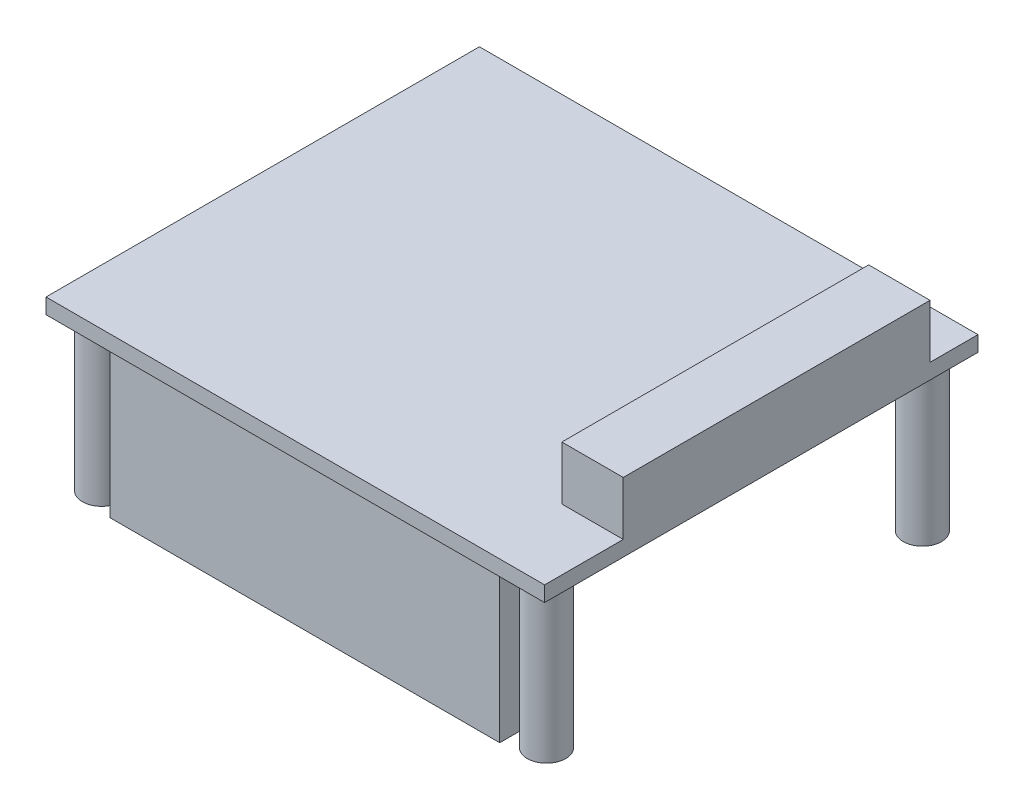
ISO-10303-21;
HEADER;
FILE_DESCRIPTION(('STEP AP214'),'2;1');
FILE_NAME('part.step','',(''),(''),'','','');
FILE_SCHEMA(('AUTOMOTIVE_DESIGN { 1 0 10303 214 1 1 1 1 }'));
ENDSEC;
DATA;
#1=APPLICATION_CONTEXT('core data for automotive mechanical design processes');
#2=APPLICATION_PROTOCOL_DEFINITION('international standard','automotive_design',2000,#1);
#3=PRODUCT_CONTEXT('',#1,'mechanical');
#4=PRODUCT('Part','Part','',(#3));
#5=PRODUCT_RELATED_PRODUCT_CATEGORY('part','',(#4));
#6=PRODUCT_DEFINITION_FORMATION('','',#4);
#7=PRODUCT_DEFINITION_CONTEXT('part definition',#1,'design');
#8=PRODUCT_DEFINITION('design','',#6,#7);
#9=PRODUCT_DEFINITION_SHAPE('','',#8);
#10=(LENGTH_UNIT() NAMED_UNIT(*) SI_UNIT(.MILLI.,.METRE.));
#11=(NAMED_UNIT(*) PLANE_ANGLE_UNIT() SI_UNIT($,.RADIAN.));
#12=(NAMED_UNIT(*) SI_UNIT($,.STERADIAN.) SOLID_ANGLE_UNIT());
#13=UNCERTAINTY_MEASURE_WITH_UNIT(LENGTH_MEASURE(1.E-05),#10,'distance_accuracy_value','');
#14=(GEOMETRIC_REPRESENTATION_CONTEXT(3) GLOBAL_UNCERTAINTY_ASSIGNED_CONTEXT((#13)) GLOBAL_UNIT_ASSIGNED_CONTEXT((#10,
#11,#12)) REPRESENTATION_CONTEXT('',''));
#15=CARTESIAN_POINT('',(0.,0.,0.));
#16=DIRECTION('',(0.,0.,1.));
#17=DIRECTION('',(1.,0.,0.));
#18=AXIS2_PLACEMENT_3D('',#15,#16,#17);
#19=CARTESIAN_POINT('',(0.,20.,0.));
#20=DIRECTION('',(0.,1.,0.));
#21=DIRECTION('',(0.,0.,1.));
#22=AXIS2_PLACEMENT_3D('',#19,#20,#21);
#23=PLANE('',#22);
#24=DIRECTION('',(0.,0.,1.));
#25=VECTOR('',#24,1.);
#26=CARTESIAN_POINT('',(-32.5,20.,-28.25));
#27=LINE('',#26,#25);
#28=CARTESIAN_POINT('',(-32.5,20.,-28.25));
#29=VERTEX_POINT('',#28);
#30=CARTESIAN_POINT('',(-32.5,20.,28.25));
#31=VERTEX_POINT('',#30);
#32=EDGE_CURVE('E193',#29,#31,#27,.T.);
#33=ORIENTED_EDGE('',*,*,#32,.F.);
#34=DIRECTION('',(-1.,0.,0.));
#35=VECTOR('',#34,1.);
#36=CARTESIAN_POINT('',(32.5,20.,-28.25));
#37=LINE('',#36,#35);
#38=CARTESIAN_POINT('',(32.5,20.,-28.25));
#39=VERTEX_POINT('',#38);
#40=EDGE_CURVE('E199',#39,#29,#37,.T.);
#41=ORIENTED_EDGE('',*,*,#40,.F.);
#42=DIRECTION('',(0.,0.,-1.));
#43=VECTOR('',#42,1.);
#44=CARTESIAN_POINT('',(32.5,20.,28.25));
#45=LINE('',#44,#43);
#46=CARTESIAN_POINT('',(32.5,20.,28.25));
#47=VERTEX_POINT('',#46);
#48=EDGE_CURVE('E215',#47,#39,#45,.T.);
#49=ORIENTED_EDGE('',*,*,#48,.F.);
#50=DIRECTION('',(1.,0.,0.));
#51=VECTOR('',#50,1.);
#52=CARTESIAN_POINT('',(-32.5,20.,28.25));
#53=LINE('',#52,#51);
#54=EDGE_CURVE('E209',#31,#47,#53,.T.);
#55=ORIENTED_EDGE('',*,*,#54,.F.);
#56=EDGE_LOOP('',(#33,#41,#49,#55));
#57=FACE_BOUND('',#56,.T.);
#58=CARTESIAN_POINT('',(-29.,20.,-24.5));
#59=DIRECTION('',(0.,1.,0.));
#60=DIRECTION('',(0.,0.,1.));
#61=AXIS2_PLACEMENT_3D('',#58,#59,#60);
#62=CIRCLE('',#61,2.5);
#63=CARTESIAN_POINT('',(-29.,20.,-22.));
#64=VERTEX_POINT('',#63);
#65=EDGE_CURVE('E230',#64,#64,#62,.T.);
#66=ORIENTED_EDGE('',*,*,#65,.T.);
#67=EDGE_LOOP('',(#66));
#68=FACE_BOUND('',#67,.T.);
#69=CARTESIAN_POINT('',(-29.,20.,24.5));
#70=DIRECTION('',(0.,1.,0.));
#71=DIRECTION('',(0.,0.,1.));
#72=AXIS2_PLACEMENT_3D('',#69,#70,#71);
#73=CIRCLE('',#72,2.5);
#74=CARTESIAN_POINT('',(-29.,20.,27.));
#75=VERTEX_POINT('',#74);
#76=EDGE_CURVE('E229',#75,#75,#73,.F.);
#77=ORIENTED_EDGE('',*,*,#76,.F.);
#78=EDGE_LOOP('',(#77));
#79=FACE_BOUND('',#78,.T.);
#80=CARTESIAN_POINT('',(29.,20.,-24.5));
#81=DIRECTION('',(0.,1.,0.));
#82=DIRECTION('',(0.,0.,1.));
#83=AXIS2_PLACEMENT_3D('',#80,#81,#82);
#84=CIRCLE('',#83,2.5);
#85=CARTESIAN_POINT('',(29.,20.,-22.));
#86=VERTEX_POINT('',#85);
#87=EDGE_CURVE('E51',#86,#86,#84,.F.);
#88=ORIENTED_EDGE('',*,*,#87,.F.);
#89=EDGE_LOOP('',(#88));
#90=FACE_BOUND('',#89,.T.);
#91=CARTESIAN_POINT('',(29.,20.,24.5));
#92=DIRECTION('',(0.,1.,0.));
#93=DIRECTION('',(0.,0.,1.));
#94=AXIS2_PLACEMENT_3D('',#91,#92,#93);
#95=CIRCLE('',#94,2.5);
#96=CARTESIAN_POINT('',(29.,20.,27.));
#97=VERTEX_POINT('',#96);
#98=EDGE_CURVE('E11',#97,#97,#95,.F.);
#99=ORIENTED_EDGE('',*,*,#98,.F.);
#100=EDGE_LOOP('',(#99));
#101=FACE_BOUND('',#100,.T.);
#102=DIRECTION('',(0.,0.,1.));
#103=VECTOR('',#102,1.);
#104=CARTESIAN_POINT('',(-25.4,20.,22.));
#105=LINE('',#104,#103);
#106=CARTESIAN_POINT('',(-25.4,20.,22.));
#107=VERTEX_POINT('',#106);
#108=CARTESIAN_POINT('',(-25.4,20.,27.));
#109=VERTEX_POINT('',#108);
#110=EDGE_CURVE('E161',#107,#109,#105,.T.);
#111=ORIENTED_EDGE('',*,*,#110,.T.);
#112=DIRECTION('',(1.,0.,0.));
#113=VECTOR('',#112,1.);
#114=CARTESIAN_POINT('',(-25.4,20.,27.));
#115=LINE('',#114,#113);
#116=CARTESIAN_POINT('',(25.4,20.,27.));
#117=VERTEX_POINT('',#116);
#118=EDGE_CURVE('E162',#109,#117,#115,.T.);
#119=ORIENTED_EDGE('',*,*,#118,.T.);
#120=DIRECTION('',(0.,0.,-1.));
#121=VECTOR('',#120,1.);
#122=CARTESIAN_POINT('',(25.4,20.,27.));
#123=LINE('',#122,#121);
#124=CARTESIAN_POINT('',(25.4,20.,22.));
#125=VERTEX_POINT('',#124);
#126=EDGE_CURVE('E167',#117,#125,#123,.T.);
#127=ORIENTED_EDGE('',*,*,#126,.T.);
#128=DIRECTION('',(-1.,0.,0.));
#129=VECTOR('',#128,1.);
#130=CARTESIAN_POINT('',(25.4,20.,22.));
#131=LINE('',#130,#129);
#132=EDGE_CURVE('E169',#125,#107,#131,.T.);
#133=ORIENTED_EDGE('',*,*,#132,.T.);
#134=EDGE_LOOP('',(#111,#119,#127,#133));
#135=FACE_BOUND('',#134,.T.);
#136=ADVANCED_FACE('F43',(#57,#68,#79,#90,#101,#135),#23,.F.);
#137=CARTESIAN_POINT('',(-29.,20.,-24.5));
#138=DIRECTION('',(0.,-1.,0.));
#139=DIRECTION('',(0.,0.,-1.));
#140=AXIS2_PLACEMENT_3D('',#137,#138,#139);
#141=CYLINDRICAL_SURFACE('',#140,2.5);
#142=ORIENTED_EDGE('',*,*,#65,.F.);
#143=EDGE_LOOP('',(#142));
#144=FACE_BOUND('',#143,.T.);
#145=CARTESIAN_POINT('',(-29.,0.,-24.5));
#146=DIRECTION('',(0.,1.,0.));
#147=DIRECTION('',(0.,0.,1.));
#148=AXIS2_PLACEMENT_3D('',#145,#146,#147);
#149=CIRCLE('',#148,2.5);
#150=CARTESIAN_POINT('',(-29.,0.,-22.));
#151=VERTEX_POINT('',#150);
#152=EDGE_CURVE('E226',#151,#151,#149,.T.);
#153=ORIENTED_EDGE('',*,*,#152,.T.);
#154=EDGE_LOOP('',(#153));
#155=FACE_BOUND('',#154,.T.);
#156=ADVANCED_FACE('F44',(#144,#155),#141,.T.);
#157=CARTESIAN_POINT('',(-29.,0.,-24.5));
#158=DIRECTION('',(0.,1.,0.));
#159=DIRECTION('',(0.,0.,1.));
#160=AXIS2_PLACEMENT_3D('',#157,#158,#159);
#161=PLANE('',#160);
#162=ORIENTED_EDGE('',*,*,#152,.F.);
#163=EDGE_LOOP('',(#162));
#164=FACE_BOUND('',#163,.T.);
#165=ADVANCED_FACE('F319',(#164),#161,.F.);
#166=CARTESIAN_POINT('',(-32.5,22.,-28.25));
#167=DIRECTION('',(1.,0.,0.));
#168=DIRECTION('',(0.,0.,-1.));
#169=AXIS2_PLACEMENT_3D('',#166,#167,#168);
#170=PLANE('',#169);
#171=ORIENTED_EDGE('',*,*,#32,.T.);
#172=DIRECTION('',(0.,-1.,0.));
#173=VECTOR('',#172,1.);
#174=CARTESIAN_POINT('',(-32.5,22.,28.25));
#175=LINE('',#174,#173);
#176=CARTESIAN_POINT('',(-32.5,22.,28.25));
#177=VERTEX_POINT('',#176);
#178=EDGE_CURVE('E224',#177,#31,#175,.T.);
#179=ORIENTED_EDGE('',*,*,#178,.F.);
#180=DIRECTION('',(0.,0.,1.));
#181=VECTOR('',#180,1.);
#182=CARTESIAN_POINT('',(-32.5,22.,-28.25));
#183=LINE('',#182,#181);
#184=CARTESIAN_POINT('',(-32.5,22.,-28.25));
#185=VERTEX_POINT('',#184);
#186=EDGE_CURVE('E198',#185,#177,#183,.T.);
#187=ORIENTED_EDGE('',*,*,#186,.F.);
#188=DIRECTION('',(0.,-1.,0.));
#189=VECTOR('',#188,1.);
#190=CARTESIAN_POINT('',(-32.5,22.,-28.25));
#191=LINE('',#190,#189);
#192=EDGE_CURVE('E210',#185,#29,#191,.T.);
#193=ORIENTED_EDGE('',*,*,#192,.T.);
#194=EDGE_LOOP('',(#171,#179,#187,#193));
#195=FACE_BOUND('',#194,.T.);
#196=ADVANCED_FACE('F320',(#195),#170,.F.);
#197=CARTESIAN_POINT('',(-32.5,22.,28.25));
#198=DIRECTION('',(0.,0.,-1.));
#199=DIRECTION('',(-1.,0.,0.));
#200=AXIS2_PLACEMENT_3D('',#197,#198,#199);
#201=PLANE('',#200);
#202=ORIENTED_EDGE('',*,*,#54,.T.);
#203=DIRECTION('',(0.,-1.,0.));
#204=VECTOR('',#203,1.);
#205=CARTESIAN_POINT('',(32.5,22.,28.25));
#206=LINE('',#205,#204);
#207=CARTESIAN_POINT('',(32.5,22.,28.25));
#208=VERTEX_POINT('',#207);
#209=EDGE_CURVE('E219',#208,#47,#206,.T.);
#210=ORIENTED_EDGE('',*,*,#209,.F.);
#211=DIRECTION('',(1.,0.,0.));
#212=VECTOR('',#211,1.);
#213=CARTESIAN_POINT('',(-32.5,22.,28.25));
#214=LINE('',#213,#212);
#215=EDGE_CURVE('E200',#177,#208,#214,.T.);
#216=ORIENTED_EDGE('',*,*,#215,.F.);
#217=ORIENTED_EDGE('',*,*,#178,.T.);
#218=EDGE_LOOP('',(#202,#210,#216,#217));
#219=FACE_BOUND('',#218,.T.);
#220=ADVANCED_FACE('F311',(#219),#201,.F.);
#221=CARTESIAN_POINT('',(32.5,22.,28.25));
#222=DIRECTION('',(-1.,0.,0.));
#223=DIRECTION('',(0.,0.,1.));
#224=AXIS2_PLACEMENT_3D('',#221,#222,#223);
#225=PLANE('',#224);
#226=ORIENTED_EDGE('',*,*,#48,.T.);
#227=DIRECTION('',(0.,-1.,0.));
#228=VECTOR('',#227,1.);
#229=CARTESIAN_POINT('',(32.5,22.,-28.25));
#230=LINE('',#229,#228);
#231=CARTESIAN_POINT('',(32.5,22.,-28.25));
#232=VERTEX_POINT('',#231);
#233=EDGE_CURVE('E220',#232,#39,#230,.T.);
#234=ORIENTED_EDGE('',*,*,#233,.F.);
#235=DIRECTION('',(0.,0.,-1.));
#236=VECTOR('',#235,1.);
#237=CARTESIAN_POINT('',(32.5,22.,28.25));
#238=LINE('',#237,#236);
#239=CARTESIAN_POINT('',(32.5,22.,-22.));
#240=VERTEX_POINT('',#239);
#241=EDGE_CURVE('E205',#240,#232,#238,.T.);
#242=ORIENTED_EDGE('',*,*,#241,.F.);
#243=DIRECTION('',(0.,-1.,0.));
#244=VECTOR('',#243,1.);
#245=CARTESIAN_POINT('',(32.5,29.,-22.));
#246=LINE('',#245,#244);
#247=CARTESIAN_POINT('',(32.5,29.,-22.));
#248=VERTEX_POINT('',#247);
#249=EDGE_CURVE('E160',#248,#240,#246,.T.);
#250=ORIENTED_EDGE('',*,*,#249,.F.);
#251=DIRECTION('',(0.,0.,-1.));
#252=VECTOR('',#251,1.);
#253=CARTESIAN_POINT('',(32.5,29.,18.));
#254=LINE('',#253,#252);
#255=CARTESIAN_POINT('',(32.5,29.,18.));
#256=VERTEX_POINT('',#255);
#257=EDGE_CURVE('E136',#256,#248,#254,.T.);
#258=ORIENTED_EDGE('',*,*,#257,.F.);
#259=DIRECTION('',(0.,-1.,0.));
#260=VECTOR('',#259,1.);
#261=CARTESIAN_POINT('',(32.5,29.,18.));
#262=LINE('',#261,#260);
#263=CARTESIAN_POINT('',(32.5,22.,18.));
#264=VERTEX_POINT('',#263);
#265=EDGE_CURVE('E137',#256,#264,#262,.T.);
#266=ORIENTED_EDGE('',*,*,#265,.T.);
#267=EDGE_CURVE('E201',#208,#264,#238,.T.);
#268=ORIENTED_EDGE('',*,*,#267,.F.);
#269=ORIENTED_EDGE('',*,*,#209,.T.);
#270=EDGE_LOOP('',(#226,#234,#242,#250,#258,#266,#268,#269));
#271=FACE_BOUND('',#270,.T.);
#272=ADVANCED_FACE('F310',(#271),#225,.F.);
#273=CARTESIAN_POINT('',(32.5,22.,-28.25));
#274=DIRECTION('',(0.,0.,1.));
#275=DIRECTION('',(1.,0.,0.));
#276=AXIS2_PLACEMENT_3D('',#273,#274,#275);
#277=PLANE('',#276);
#278=ORIENTED_EDGE('',*,*,#40,.T.);
#279=ORIENTED_EDGE('',*,*,#192,.F.);
#280=DIRECTION('',(-1.,0.,0.));
#281=VECTOR('',#280,1.);
#282=CARTESIAN_POINT('',(32.5,22.,-28.25));
#283=LINE('',#282,#281);
#284=EDGE_CURVE('E202',#232,#185,#283,.T.);
#285=ORIENTED_EDGE('',*,*,#284,.F.);
#286=ORIENTED_EDGE('',*,*,#233,.T.);
#287=EDGE_LOOP('',(#278,#279,#285,#286));
#288=FACE_BOUND('',#287,.T.);
#289=ADVANCED_FACE('F303',(#288),#277,.F.);
#290=CARTESIAN_POINT('',(0.,22.,0.));
#291=DIRECTION('',(0.,1.,0.));
#292=DIRECTION('',(0.,0.,1.));
#293=AXIS2_PLACEMENT_3D('',#290,#291,#292);
#294=PLANE('',#293);
#295=DIRECTION('',(-1.,0.,0.));
#296=VECTOR('',#295,1.);
#297=CARTESIAN_POINT('',(32.5,22.,-22.));
#298=LINE('',#297,#296);
#299=CARTESIAN_POINT('',(24.5,22.,-22.));
#300=VERTEX_POINT('',#299);
#301=EDGE_CURVE('E149',#240,#300,#298,.T.);
#302=ORIENTED_EDGE('',*,*,#301,.F.);
#303=ORIENTED_EDGE('',*,*,#241,.T.);
#304=ORIENTED_EDGE('',*,*,#284,.T.);
#305=ORIENTED_EDGE('',*,*,#186,.T.);
#306=ORIENTED_EDGE('',*,*,#215,.T.);
#307=ORIENTED_EDGE('',*,*,#267,.T.);
#308=DIRECTION('',(1.,0.,0.));
#309=VECTOR('',#308,1.);
#310=CARTESIAN_POINT('',(24.5,22.,18.));
#311=LINE('',#310,#309);
#312=CARTESIAN_POINT('',(24.5,22.,18.));
#313=VERTEX_POINT('',#312);
#314=EDGE_CURVE('E62',#313,#264,#311,.T.);
#315=ORIENTED_EDGE('',*,*,#314,.F.);
#316=DIRECTION('',(0.,0.,1.));
#317=VECTOR('',#316,1.);
#318=CARTESIAN_POINT('',(24.5,22.,-22.));
#319=LINE('',#318,#317);
#320=EDGE_CURVE('E59',#300,#313,#319,.T.);
#321=ORIENTED_EDGE('',*,*,#320,.F.);
#322=EDGE_LOOP('',(#302,#303,#304,#305,#306,#307,#315,#321));
#323=FACE_BOUND('',#322,.T.);
#324=ADVANCED_FACE('F304',(#323),#294,.T.);
#325=CARTESIAN_POINT('',(-29.,20.,24.5));
#326=DIRECTION('',(0.,-1.,0.));
#327=DIRECTION('',(0.,0.,-1.));
#328=AXIS2_PLACEMENT_3D('',#325,#326,#327);
#329=CYLINDRICAL_SURFACE('',#328,2.5);
#330=ORIENTED_EDGE('',*,*,#76,.T.);
#331=EDGE_LOOP('',(#330));
#332=FACE_BOUND('',#331,.T.);
#333=CARTESIAN_POINT('',(-29.,0.,24.5));
#334=DIRECTION('',(0.,1.,0.));
#335=DIRECTION('',(0.,0.,1.));
#336=AXIS2_PLACEMENT_3D('',#333,#334,#335);
#337=CIRCLE('',#336,2.5);
#338=CARTESIAN_POINT('',(-29.,0.,27.));
#339=VERTEX_POINT('',#338);
#340=EDGE_CURVE('E194',#339,#339,#337,.T.);
#341=ORIENTED_EDGE('',*,*,#340,.T.);
#342=EDGE_LOOP('',(#341));
#343=FACE_BOUND('',#342,.T.);
#344=ADVANCED_FACE('F297',(#332,#343),#329,.T.);
#345=CARTESIAN_POINT('',(-29.,0.,24.5));
#346=DIRECTION('',(0.,1.,0.));
#347=DIRECTION('',(0.,0.,1.));
#348=AXIS2_PLACEMENT_3D('',#345,#346,#347);
#349=PLANE('',#348);
#350=ORIENTED_EDGE('',*,*,#340,.F.);
#351=EDGE_LOOP('',(#350));
#352=FACE_BOUND('',#351,.T.);
#353=ADVANCED_FACE('F293',(#352),#349,.F.);
#354=CARTESIAN_POINT('',(29.,20.,-24.5));
#355=DIRECTION('',(0.,-1.,0.));
#356=DIRECTION('',(0.,0.,-1.));
#357=AXIS2_PLACEMENT_3D('',#354,#355,#356);
#358=CYLINDRICAL_SURFACE('',#357,2.5);
#359=ORIENTED_EDGE('',*,*,#87,.T.);
#360=EDGE_LOOP('',(#359));
#361=FACE_BOUND('',#360,.T.);
#362=CARTESIAN_POINT('',(29.,0.,-24.5));
#363=DIRECTION('',(0.,1.,0.));
#364=DIRECTION('',(0.,0.,1.));
#365=AXIS2_PLACEMENT_3D('',#362,#363,#364);
#366=CIRCLE('',#365,2.5);
#367=CARTESIAN_POINT('',(29.,0.,-22.));
#368=VERTEX_POINT('',#367);
#369=EDGE_CURVE('E188',#368,#368,#366,.T.);
#370=ORIENTED_EDGE('',*,*,#369,.T.);
#371=EDGE_LOOP('',(#370));
#372=FACE_BOUND('',#371,.T.);
#373=ADVANCED_FACE('F240',(#361,#372),#358,.T.);
#374=CARTESIAN_POINT('',(29.,0.,-24.5));
#375=DIRECTION('',(0.,1.,0.));
#376=DIRECTION('',(0.,0.,1.));
#377=AXIS2_PLACEMENT_3D('',#374,#375,#376);
#378=PLANE('',#377);
#379=ORIENTED_EDGE('',*,*,#369,.F.);
#380=EDGE_LOOP('',(#379));
#381=FACE_BOUND('',#380,.T.);
#382=ADVANCED_FACE('F290',(#381),#378,.F.);
#383=CARTESIAN_POINT('',(29.,20.,24.5));
#384=DIRECTION('',(0.,-1.,0.));
#385=DIRECTION('',(0.,0.,-1.));
#386=AXIS2_PLACEMENT_3D('',#383,#384,#385);
#387=CYLINDRICAL_SURFACE('',#386,2.5);
#388=ORIENTED_EDGE('',*,*,#98,.T.);
#389=EDGE_LOOP('',(#388));
#390=FACE_BOUND('',#389,.T.);
#391=CARTESIAN_POINT('',(29.,0.,24.5));
#392=DIRECTION('',(0.,1.,0.));
#393=DIRECTION('',(0.,0.,1.));
#394=AXIS2_PLACEMENT_3D('',#391,#392,#393);
#395=CIRCLE('',#394,2.5);
#396=CARTESIAN_POINT('',(29.,0.,27.));
#397=VERTEX_POINT('',#396);
#398=EDGE_CURVE('E186',#397,#397,#395,.T.);
#399=ORIENTED_EDGE('',*,*,#398,.T.);
#400=EDGE_LOOP('',(#399));
#401=FACE_BOUND('',#400,.T.);
#402=ADVANCED_FACE('F283',(#390,#401),#387,.T.);
#403=CARTESIAN_POINT('',(29.,0.,24.5));
#404=DIRECTION('',(0.,1.,0.));
#405=DIRECTION('',(0.,0.,1.));
#406=AXIS2_PLACEMENT_3D('',#403,#404,#405);
#407=PLANE('',#406);
#408=ORIENTED_EDGE('',*,*,#398,.F.);
#409=EDGE_LOOP('',(#408));
#410=FACE_BOUND('',#409,.T.);
#411=ADVANCED_FACE('F281',(#410),#407,.F.);
#412=CARTESIAN_POINT('',(-25.4,20.,22.));
#413=DIRECTION('',(1.,0.,0.));
#414=DIRECTION('',(0.,0.,-1.));
#415=AXIS2_PLACEMENT_3D('',#412,#413,#414);
#416=PLANE('',#415);
#417=DIRECTION('',(0.,0.,1.));
#418=VECTOR('',#417,1.);
#419=CARTESIAN_POINT('',(-25.4,0.,22.));
#420=LINE('',#419,#418);
#421=CARTESIAN_POINT('',(-25.4,0.,22.));
#422=VERTEX_POINT('',#421);
#423=CARTESIAN_POINT('',(-25.4,0.,27.));
#424=VERTEX_POINT('',#423);
#425=EDGE_CURVE('E155',#422,#424,#420,.T.);
#426=ORIENTED_EDGE('',*,*,#425,.T.);
#427=DIRECTION('',(0.,-1.,0.));
#428=VECTOR('',#427,1.);
#429=CARTESIAN_POINT('',(-25.4,20.,27.));
#430=LINE('',#429,#428);
#431=EDGE_CURVE('E181',#109,#424,#430,.T.);
#432=ORIENTED_EDGE('',*,*,#431,.F.);
#433=ORIENTED_EDGE('',*,*,#110,.F.);
#434=DIRECTION('',(0.,-1.,0.));
#435=VECTOR('',#434,1.);
#436=CARTESIAN_POINT('',(-25.4,20.,22.));
#437=LINE('',#436,#435);
#438=EDGE_CURVE('E166',#107,#422,#437,.T.);
#439=ORIENTED_EDGE('',*,*,#438,.T.);
#440=EDGE_LOOP('',(#426,#432,#433,#439));
#441=FACE_BOUND('',#440,.T.);
#442=ADVANCED_FACE('F258',(#441),#416,.F.);
#443=CARTESIAN_POINT('',(-25.4,20.,27.));
#444=DIRECTION('',(0.,0.,-1.));
#445=DIRECTION('',(-1.,0.,0.));
#446=AXIS2_PLACEMENT_3D('',#443,#444,#445);
#447=PLANE('',#446);
#448=DIRECTION('',(1.,0.,0.));
#449=VECTOR('',#448,1.);
#450=CARTESIAN_POINT('',(-25.4,0.,27.));
#451=LINE('',#450,#449);
#452=CARTESIAN_POINT('',(25.4,0.,27.));
#453=VERTEX_POINT('',#452);
#454=EDGE_CURVE('E154',#424,#453,#451,.T.);
#455=ORIENTED_EDGE('',*,*,#454,.T.);
#456=DIRECTION('',(0.,-1.,0.));
#457=VECTOR('',#456,1.);
#458=CARTESIAN_POINT('',(25.4,20.,27.));
#459=LINE('',#458,#457);
#460=EDGE_CURVE('E178',#117,#453,#459,.T.);
#461=ORIENTED_EDGE('',*,*,#460,.F.);
#462=ORIENTED_EDGE('',*,*,#118,.F.);
#463=ORIENTED_EDGE('',*,*,#431,.T.);
#464=EDGE_LOOP('',(#455,#461,#462,#463));
#465=FACE_BOUND('',#464,.T.);
#466=ADVANCED_FACE('F255',(#465),#447,.F.);
#467=CARTESIAN_POINT('',(25.4,20.,27.));
#468=DIRECTION('',(-1.,0.,0.));
#469=DIRECTION('',(0.,0.,1.));
#470=AXIS2_PLACEMENT_3D('',#467,#468,#469);
#471=PLANE('',#470);
#472=DIRECTION('',(0.,0.,-1.));
#473=VECTOR('',#472,1.);
#474=CARTESIAN_POINT('',(25.4,0.,27.));
#475=LINE('',#474,#473);
#476=CARTESIAN_POINT('',(25.4,0.,22.));
#477=VERTEX_POINT('',#476);
#478=EDGE_CURVE('E175',#453,#477,#475,.T.);
#479=ORIENTED_EDGE('',*,*,#478,.T.);
#480=DIRECTION('',(0.,-1.,0.));
#481=VECTOR('',#480,1.);
#482=CARTESIAN_POINT('',(25.4,20.,22.));
#483=LINE('',#482,#481);
#484=EDGE_CURVE('E179',#125,#477,#483,.T.);
#485=ORIENTED_EDGE('',*,*,#484,.F.);
#486=ORIENTED_EDGE('',*,*,#126,.F.);
#487=ORIENTED_EDGE('',*,*,#460,.T.);
#488=EDGE_LOOP('',(#479,#485,#486,#487));
#489=FACE_BOUND('',#488,.T.);
#490=ADVANCED_FACE('F263',(#489),#471,.F.);
#491=CARTESIAN_POINT('',(25.4,20.,22.));
#492=DIRECTION('',(0.,0.,1.));
#493=DIRECTION('',(1.,0.,0.));
#494=AXIS2_PLACEMENT_3D('',#491,#492,#493);
#495=PLANE('',#494);
#496=DIRECTION('',(-1.,0.,0.));
#497=VECTOR('',#496,1.);
#498=CARTESIAN_POINT('',(25.4,0.,22.));
#499=LINE('',#498,#497);
#500=EDGE_CURVE('E163',#477,#422,#499,.T.);
#501=ORIENTED_EDGE('',*,*,#500,.T.);
#502=ORIENTED_EDGE('',*,*,#438,.F.);
#503=ORIENTED_EDGE('',*,*,#132,.F.);
#504=ORIENTED_EDGE('',*,*,#484,.T.);
#505=EDGE_LOOP('',(#501,#502,#503,#504));
#506=FACE_BOUND('',#505,.T.);
#507=ADVANCED_FACE('F266',(#506),#495,.F.);
#508=CARTESIAN_POINT('',(0.,0.,0.));
#509=DIRECTION('',(0.,1.,0.));
#510=DIRECTION('',(0.,0.,1.));
#511=AXIS2_PLACEMENT_3D('',#508,#509,#510);
#512=PLANE('',#511);
#513=ORIENTED_EDGE('',*,*,#425,.F.);
#514=ORIENTED_EDGE('',*,*,#500,.F.);
#515=ORIENTED_EDGE('',*,*,#478,.F.);
#516=ORIENTED_EDGE('',*,*,#454,.F.);
#517=EDGE_LOOP('',(#513,#514,#515,#516));
#518=FACE_BOUND('',#517,.T.);
#519=ADVANCED_FACE('F257',(#518),#512,.F.);
#520=CARTESIAN_POINT('',(24.5,29.,-22.));
#521=DIRECTION('',(1.,0.,0.));
#522=DIRECTION('',(0.,0.,-1.));
#523=AXIS2_PLACEMENT_3D('',#520,#521,#522);
#524=PLANE('',#523);
#525=ORIENTED_EDGE('',*,*,#320,.T.);
#526=DIRECTION('',(0.,-1.,0.));
#527=VECTOR('',#526,1.);
#528=CARTESIAN_POINT('',(24.5,29.,18.));
#529=LINE('',#528,#527);
#530=CARTESIAN_POINT('',(24.5,29.,18.));
#531=VERTEX_POINT('',#530);
#532=EDGE_CURVE('E133',#531,#313,#529,.T.);
#533=ORIENTED_EDGE('',*,*,#532,.F.);
#534=DIRECTION('',(0.,0.,1.));
#535=VECTOR('',#534,1.);
#536=CARTESIAN_POINT('',(24.5,29.,-22.));
#537=LINE('',#536,#535);
#538=CARTESIAN_POINT('',(24.5,29.,-22.));
#539=VERTEX_POINT('',#538);
#540=EDGE_CURVE('E138',#539,#531,#537,.T.);
#541=ORIENTED_EDGE('',*,*,#540,.F.);
#542=DIRECTION('',(0.,-1.,0.));
#543=VECTOR('',#542,1.);
#544=CARTESIAN_POINT('',(24.5,29.,-22.));
#545=LINE('',#544,#543);
#546=EDGE_CURVE('E470',#539,#300,#545,.T.);
#547=ORIENTED_EDGE('',*,*,#546,.T.);
#548=EDGE_LOOP('',(#525,#533,#541,#547));
#549=FACE_BOUND('',#548,.T.);
#550=ADVANCED_FACE('F151',(#549),#524,.F.);
#551=CARTESIAN_POINT('',(24.5,29.,18.));
#552=DIRECTION('',(0.,0.,-1.));
#553=DIRECTION('',(-1.,0.,0.));
#554=AXIS2_PLACEMENT_3D('',#551,#552,#553);
#555=PLANE('',#554);
#556=ORIENTED_EDGE('',*,*,#314,.T.);
#557=ORIENTED_EDGE('',*,*,#265,.F.);
#558=DIRECTION('',(1.,0.,0.));
#559=VECTOR('',#558,1.);
#560=CARTESIAN_POINT('',(24.5,29.,18.));
#561=LINE('',#560,#559);
#562=EDGE_CURVE('E128',#531,#256,#561,.T.);
#563=ORIENTED_EDGE('',*,*,#562,.F.);
#564=ORIENTED_EDGE('',*,*,#532,.T.);
#565=EDGE_LOOP('',(#556,#557,#563,#564));
#566=FACE_BOUND('',#565,.T.);
#567=ADVANCED_FACE('F135',(#566),#555,.F.);
#568=CARTESIAN_POINT('',(32.5,29.,-22.));
#569=DIRECTION('',(0.,0.,1.));
#570=DIRECTION('',(1.,0.,0.));
#571=AXIS2_PLACEMENT_3D('',#568,#569,#570);
#572=PLANE('',#571);
#573=ORIENTED_EDGE('',*,*,#301,.T.);
#574=ORIENTED_EDGE('',*,*,#546,.F.);
#575=DIRECTION('',(-1.,0.,0.));
#576=VECTOR('',#575,1.);
#577=CARTESIAN_POINT('',(32.5,29.,-22.));
#578=LINE('',#577,#576);
#579=EDGE_CURVE('E144',#248,#539,#578,.T.);
#580=ORIENTED_EDGE('',*,*,#579,.F.);
#581=ORIENTED_EDGE('',*,*,#249,.T.);
#582=EDGE_LOOP('',(#573,#574,#580,#581));
#583=FACE_BOUND('',#582,.T.);
#584=ADVANCED_FACE('F430',(#583),#572,.F.);
#585=CARTESIAN_POINT('',(0.,29.,0.));
#586=DIRECTION('',(0.,1.,0.));
#587=DIRECTION('',(0.,0.,1.));
#588=AXIS2_PLACEMENT_3D('',#585,#586,#587);
#589=PLANE('',#588);
#590=ORIENTED_EDGE('',*,*,#540,.T.);
#591=ORIENTED_EDGE('',*,*,#562,.T.);
#592=ORIENTED_EDGE('',*,*,#257,.T.);
#593=ORIENTED_EDGE('',*,*,#579,.T.);
#594=EDGE_LOOP('',(#590,#591,#592,#593));
#595=FACE_BOUND('',#594,.T.);
#596=ADVANCED_FACE('F141',(#595),#589,.T.);
#597=CLOSED_SHELL('',(#136,#156,#165,#196,#220,#272,#289,#324,#344,#353,#373,#382,#402,#411,
#442,#466,#490,#507,#519,#550,#567,#584,#596));
#598=MANIFOLD_SOLID_BREP('B2',#597);
#599=ADVANCED_BREP_SHAPE_REPRESENTATION('',(#18,#598),#14);
#600=SHAPE_DEFINITION_REPRESENTATION(#9,#599);
ENDSEC;
END-ISO-10303-21;
